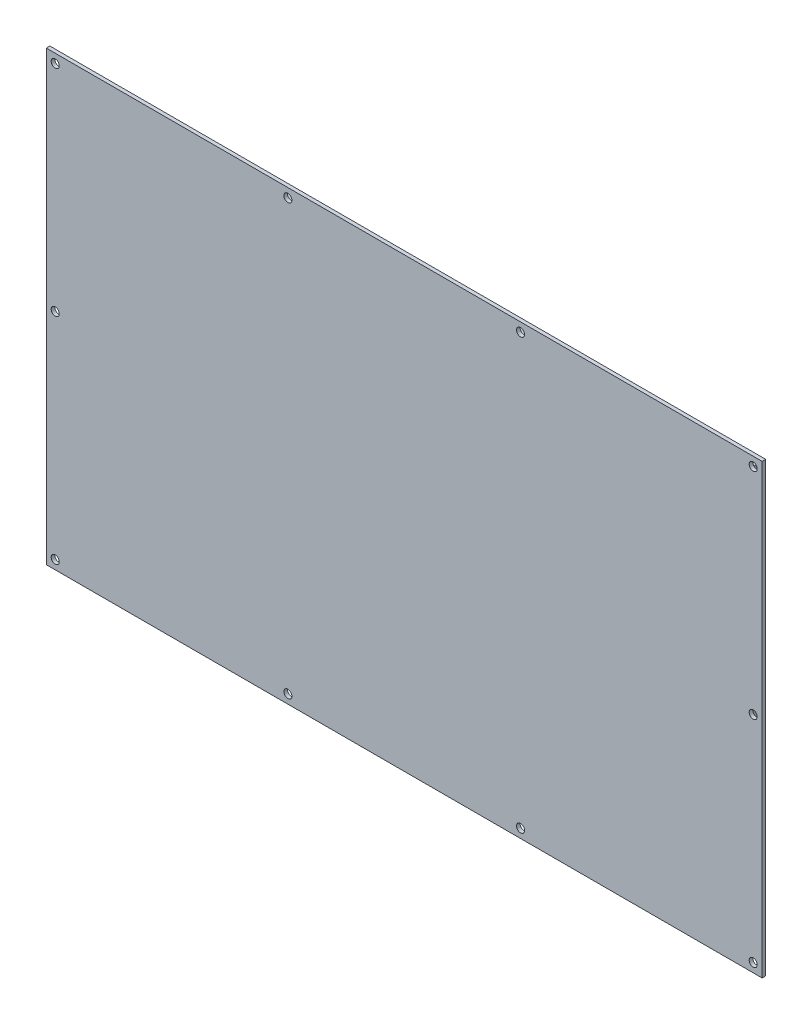
ISO-10303-21;
HEADER;
FILE_DESCRIPTION(('STEP AP214'),'2;1');
FILE_NAME('part.step','',(''),(''),'','','');
FILE_SCHEMA(('AUTOMOTIVE_DESIGN { 1 0 10303 214 1 1 1 1 }'));
ENDSEC;
DATA;
#1=APPLICATION_CONTEXT('core data for automotive mechanical design processes');
#2=APPLICATION_PROTOCOL_DEFINITION('international standard','automotive_design',2000,#1);
#3=PRODUCT_CONTEXT('',#1,'mechanical');
#4=PRODUCT('Part','Part','',(#3));
#5=PRODUCT_RELATED_PRODUCT_CATEGORY('part','',(#4));
#6=PRODUCT_DEFINITION_FORMATION('','',#4);
#7=PRODUCT_DEFINITION_CONTEXT('part definition',#1,'design');
#8=PRODUCT_DEFINITION('design','',#6,#7);
#9=PRODUCT_DEFINITION_SHAPE('','',#8);
#10=(LENGTH_UNIT() NAMED_UNIT(*) SI_UNIT(.MILLI.,.METRE.));
#11=(NAMED_UNIT(*) PLANE_ANGLE_UNIT() SI_UNIT($,.RADIAN.));
#12=(NAMED_UNIT(*) SI_UNIT($,.STERADIAN.) SOLID_ANGLE_UNIT());
#13=UNCERTAINTY_MEASURE_WITH_UNIT(LENGTH_MEASURE(1.E-05),#10,'distance_accuracy_value','');
#14=(GEOMETRIC_REPRESENTATION_CONTEXT(3) GLOBAL_UNCERTAINTY_ASSIGNED_CONTEXT((#13)) GLOBAL_UNIT_ASSIGNED_CONTEXT((#10,
#11,#12)) REPRESENTATION_CONTEXT('',''));
#15=CARTESIAN_POINT('',(0.,0.,0.));
#16=DIRECTION('',(0.,0.,1.));
#17=DIRECTION('',(1.,0.,0.));
#18=AXIS2_PLACEMENT_3D('',#15,#16,#17);
#19=CARTESIAN_POINT('',(200.,-125.,2.));
#20=DIRECTION('',(-1.,0.,0.));
#21=DIRECTION('',(0.,0.,1.));
#22=AXIS2_PLACEMENT_3D('',#19,#20,#21);
#23=PLANE('',#22);
#24=DIRECTION('',(0.,1.,0.));
#25=VECTOR('',#24,1.);
#26=CARTESIAN_POINT('',(200.,-125.,0.));
#27=LINE('',#26,#25);
#28=CARTESIAN_POINT('',(200.,-125.,0.));
#29=VERTEX_POINT('',#28);
#30=CARTESIAN_POINT('',(200.,125.,0.));
#31=VERTEX_POINT('',#30);
#32=EDGE_CURVE('E182',#29,#31,#27,.T.);
#33=ORIENTED_EDGE('',*,*,#32,.T.);
#34=DIRECTION('',(0.,0.,-1.));
#35=VECTOR('',#34,1.);
#36=CARTESIAN_POINT('',(200.,125.,2.));
#37=LINE('',#36,#35);
#38=CARTESIAN_POINT('',(200.,125.,2.));
#39=VERTEX_POINT('',#38);
#40=EDGE_CURVE('E11',#39,#31,#37,.T.);
#41=ORIENTED_EDGE('',*,*,#40,.F.);
#42=DIRECTION('',(0.,1.,0.));
#43=VECTOR('',#42,1.);
#44=CARTESIAN_POINT('',(200.,-125.,2.));
#45=LINE('',#44,#43);
#46=CARTESIAN_POINT('',(200.,-125.,2.));
#47=VERTEX_POINT('',#46);
#48=EDGE_CURVE('E185',#47,#39,#45,.T.);
#49=ORIENTED_EDGE('',*,*,#48,.F.);
#50=DIRECTION('',(0.,0.,-1.));
#51=VECTOR('',#50,1.);
#52=CARTESIAN_POINT('',(200.,-125.,2.));
#53=LINE('',#52,#51);
#54=EDGE_CURVE('E195',#47,#29,#53,.T.);
#55=ORIENTED_EDGE('',*,*,#54,.T.);
#56=EDGE_LOOP('',(#33,#41,#49,#55));
#57=FACE_BOUND('',#56,.T.);
#58=ADVANCED_FACE('F35',(#57),#23,.F.);
#59=CARTESIAN_POINT('',(-200.,125.,2.));
#60=DIRECTION('',(0.,-1.,0.));
#61=DIRECTION('',(0.,0.,-1.));
#62=AXIS2_PLACEMENT_3D('',#59,#60,#61);
#63=PLANE('',#62);
#64=DIRECTION('',(-1.,0.,0.));
#65=VECTOR('',#64,1.);
#66=CARTESIAN_POINT('',(-200.,125.,0.));
#67=LINE('',#66,#65);
#68=CARTESIAN_POINT('',(-200.,125.,0.));
#69=VERTEX_POINT('',#68);
#70=EDGE_CURVE('E198',#31,#69,#67,.T.);
#71=ORIENTED_EDGE('',*,*,#70,.T.);
#72=DIRECTION('',(0.,0.,-1.));
#73=VECTOR('',#72,1.);
#74=CARTESIAN_POINT('',(-200.,125.,2.));
#75=LINE('',#74,#73);
#76=CARTESIAN_POINT('',(-200.,125.,2.));
#77=VERTEX_POINT('',#76);
#78=EDGE_CURVE('E42',#77,#69,#75,.T.);
#79=ORIENTED_EDGE('',*,*,#78,.F.);
#80=DIRECTION('',(-1.,0.,0.));
#81=VECTOR('',#80,1.);
#82=CARTESIAN_POINT('',(-200.,125.,2.));
#83=LINE('',#82,#81);
#84=EDGE_CURVE('E188',#39,#77,#83,.T.);
#85=ORIENTED_EDGE('',*,*,#84,.F.);
#86=ORIENTED_EDGE('',*,*,#40,.T.);
#87=EDGE_LOOP('',(#71,#79,#85,#86));
#88=FACE_BOUND('',#87,.T.);
#89=ADVANCED_FACE('F228',(#88),#63,.F.);
#90=CARTESIAN_POINT('',(-200.,-125.,2.));
#91=DIRECTION('',(1.,0.,0.));
#92=DIRECTION('',(0.,0.,-1.));
#93=AXIS2_PLACEMENT_3D('',#90,#91,#92);
#94=PLANE('',#93);
#95=DIRECTION('',(0.,-1.,0.));
#96=VECTOR('',#95,1.);
#97=CARTESIAN_POINT('',(-200.,-125.,0.));
#98=LINE('',#97,#96);
#99=CARTESIAN_POINT('',(-200.,-125.,0.));
#100=VERTEX_POINT('',#99);
#101=EDGE_CURVE('E200',#69,#100,#98,.T.);
#102=ORIENTED_EDGE('',*,*,#101,.T.);
#103=DIRECTION('',(0.,0.,-1.));
#104=VECTOR('',#103,1.);
#105=CARTESIAN_POINT('',(-200.,-125.,2.));
#106=LINE('',#105,#104);
#107=CARTESIAN_POINT('',(-200.,-125.,2.));
#108=VERTEX_POINT('',#107);
#109=EDGE_CURVE('E205',#108,#100,#106,.T.);
#110=ORIENTED_EDGE('',*,*,#109,.F.);
#111=DIRECTION('',(0.,-1.,0.));
#112=VECTOR('',#111,1.);
#113=CARTESIAN_POINT('',(-200.,-125.,2.));
#114=LINE('',#113,#112);
#115=EDGE_CURVE('E191',#77,#108,#114,.T.);
#116=ORIENTED_EDGE('',*,*,#115,.F.);
#117=ORIENTED_EDGE('',*,*,#78,.T.);
#118=EDGE_LOOP('',(#102,#110,#116,#117));
#119=FACE_BOUND('',#118,.T.);
#120=ADVANCED_FACE('F212',(#119),#94,.F.);
#121=CARTESIAN_POINT('',(-200.,-125.,2.));
#122=DIRECTION('',(0.,1.,0.));
#123=DIRECTION('',(0.,0.,1.));
#124=AXIS2_PLACEMENT_3D('',#121,#122,#123);
#125=PLANE('',#124);
#126=DIRECTION('',(1.,0.,0.));
#127=VECTOR('',#126,1.);
#128=CARTESIAN_POINT('',(-200.,-125.,0.));
#129=LINE('',#128,#127);
#130=EDGE_CURVE('E189',#100,#29,#129,.T.);
#131=ORIENTED_EDGE('',*,*,#130,.T.);
#132=ORIENTED_EDGE('',*,*,#54,.F.);
#133=DIRECTION('',(1.,0.,0.));
#134=VECTOR('',#133,1.);
#135=CARTESIAN_POINT('',(-200.,-125.,2.));
#136=LINE('',#135,#134);
#137=EDGE_CURVE('E193',#108,#47,#136,.T.);
#138=ORIENTED_EDGE('',*,*,#137,.F.);
#139=ORIENTED_EDGE('',*,*,#109,.T.);
#140=EDGE_LOOP('',(#131,#132,#138,#139));
#141=FACE_BOUND('',#140,.T.);
#142=ADVANCED_FACE('F221',(#141),#125,.F.);
#143=CARTESIAN_POINT('',(0.,0.,2.));
#144=DIRECTION('',(0.,0.,-1.));
#145=DIRECTION('',(-1.,0.,0.));
#146=AXIS2_PLACEMENT_3D('',#143,#144,#145);
#147=PLANE('',#146);
#148=CARTESIAN_POINT('',(-195.,0.,2.));
#149=DIRECTION('',(0.,0.,1.));
#150=DIRECTION('',(-1.,0.,0.));
#151=AXIS2_PLACEMENT_3D('',#148,#149,#150);
#152=CIRCLE('',#151,2.25000000000001);
#153=CARTESIAN_POINT('',(-197.25,0.,2.));
#154=VERTEX_POINT('',#153);
#155=EDGE_CURVE('E150',#154,#154,#152,.T.);
#156=ORIENTED_EDGE('',*,*,#155,.F.);
#157=EDGE_LOOP('',(#156));
#158=FACE_BOUND('',#157,.T.);
#159=CARTESIAN_POINT('',(-195.,-120.,2.));
#160=DIRECTION('',(0.,0.,1.));
#161=DIRECTION('',(-1.,0.,0.));
#162=AXIS2_PLACEMENT_3D('',#159,#160,#161);
#163=CIRCLE('',#162,2.25000000000001);
#164=CARTESIAN_POINT('',(-197.25,-120.,2.));
#165=VERTEX_POINT('',#164);
#166=EDGE_CURVE('E144',#165,#165,#163,.T.);
#167=ORIENTED_EDGE('',*,*,#166,.F.);
#168=EDGE_LOOP('',(#167));
#169=FACE_BOUND('',#168,.T.);
#170=CARTESIAN_POINT('',(195.,-120.,2.));
#171=DIRECTION('',(0.,0.,1.));
#172=DIRECTION('',(-1.,0.,0.));
#173=AXIS2_PLACEMENT_3D('',#170,#171,#172);
#174=CIRCLE('',#173,2.25000000000001);
#175=CARTESIAN_POINT('',(192.75,-120.,2.));
#176=VERTEX_POINT('',#175);
#177=EDGE_CURVE('E138',#176,#176,#174,.T.);
#178=ORIENTED_EDGE('',*,*,#177,.F.);
#179=EDGE_LOOP('',(#178));
#180=FACE_BOUND('',#179,.T.);
#181=CARTESIAN_POINT('',(195.,120.,2.));
#182=DIRECTION('',(0.,0.,1.));
#183=DIRECTION('',(1.,0.,0.));
#184=AXIS2_PLACEMENT_3D('',#181,#182,#183);
#185=CIRCLE('',#184,2.25000000000001);
#186=CARTESIAN_POINT('',(197.25,120.,2.));
#187=VERTEX_POINT('',#186);
#188=EDGE_CURVE('E131',#187,#187,#185,.T.);
#189=ORIENTED_EDGE('',*,*,#188,.F.);
#190=EDGE_LOOP('',(#189));
#191=FACE_BOUND('',#190,.T.);
#192=CARTESIAN_POINT('',(64.9999999999999,120.,2.));
#193=DIRECTION('',(0.,0.,1.));
#194=DIRECTION('',(1.,0.,0.));
#195=AXIS2_PLACEMENT_3D('',#192,#193,#194);
#196=CIRCLE('',#195,2.25000000000001);
#197=CARTESIAN_POINT('',(67.25,120.,2.));
#198=VERTEX_POINT('',#197);
#199=EDGE_CURVE('E174',#198,#198,#196,.T.);
#200=ORIENTED_EDGE('',*,*,#199,.F.);
#201=EDGE_LOOP('',(#200));
#202=FACE_BOUND('',#201,.T.);
#203=CARTESIAN_POINT('',(-65.0000000000001,120.,2.));
#204=DIRECTION('',(0.,0.,1.));
#205=DIRECTION('',(1.,0.,0.));
#206=AXIS2_PLACEMENT_3D('',#203,#204,#205);
#207=CIRCLE('',#206,2.25000000000001);
#208=CARTESIAN_POINT('',(-62.75,120.,2.));
#209=VERTEX_POINT('',#208);
#210=EDGE_CURVE('E168',#209,#209,#207,.T.);
#211=ORIENTED_EDGE('',*,*,#210,.F.);
#212=EDGE_LOOP('',(#211));
#213=FACE_BOUND('',#212,.T.);
#214=CARTESIAN_POINT('',(64.9999999999999,-120.,2.));
#215=DIRECTION('',(0.,0.,1.));
#216=DIRECTION('',(-1.,0.,0.));
#217=AXIS2_PLACEMENT_3D('',#214,#215,#216);
#218=CIRCLE('',#217,2.25000000000001);
#219=CARTESIAN_POINT('',(62.7499999999999,-120.,2.));
#220=VERTEX_POINT('',#219);
#221=EDGE_CURVE('E162',#220,#220,#218,.T.);
#222=ORIENTED_EDGE('',*,*,#221,.F.);
#223=EDGE_LOOP('',(#222));
#224=FACE_BOUND('',#223,.T.);
#225=CARTESIAN_POINT('',(-65.,-120.,2.));
#226=DIRECTION('',(0.,0.,1.));
#227=DIRECTION('',(-1.,0.,0.));
#228=AXIS2_PLACEMENT_3D('',#225,#226,#227);
#229=CIRCLE('',#228,2.25000000000001);
#230=CARTESIAN_POINT('',(-67.25,-120.,2.));
#231=VERTEX_POINT('',#230);
#232=EDGE_CURVE('E155',#231,#231,#229,.T.);
#233=ORIENTED_EDGE('',*,*,#232,.F.);
#234=EDGE_LOOP('',(#233));
#235=FACE_BOUND('',#234,.T.);
#236=CARTESIAN_POINT('',(194.999999999999,0.,2.));
#237=DIRECTION('',(0.,0.,1.));
#238=DIRECTION('',(-1.,0.,0.));
#239=AXIS2_PLACEMENT_3D('',#236,#237,#238);
#240=CIRCLE('',#239,2.25000000000001);
#241=CARTESIAN_POINT('',(192.749999999999,0.,2.));
#242=VERTEX_POINT('',#241);
#243=EDGE_CURVE('E122',#242,#242,#240,.T.);
#244=ORIENTED_EDGE('',*,*,#243,.F.);
#245=EDGE_LOOP('',(#244));
#246=FACE_BOUND('',#245,.T.);
#247=CARTESIAN_POINT('',(-195.,120.,2.));
#248=DIRECTION('',(0.,0.,1.));
#249=DIRECTION('',(1.,0.,0.));
#250=AXIS2_PLACEMENT_3D('',#247,#248,#249);
#251=CIRCLE('',#250,2.25000000000001);
#252=CARTESIAN_POINT('',(-192.75,120.,2.));
#253=VERTEX_POINT('',#252);
#254=EDGE_CURVE('E179',#253,#253,#251,.T.);
#255=ORIENTED_EDGE('',*,*,#254,.F.);
#256=EDGE_LOOP('',(#255));
#257=FACE_BOUND('',#256,.T.);
#258=ORIENTED_EDGE('',*,*,#48,.T.);
#259=ORIENTED_EDGE('',*,*,#84,.T.);
#260=ORIENTED_EDGE('',*,*,#115,.T.);
#261=ORIENTED_EDGE('',*,*,#137,.T.);
#262=EDGE_LOOP('',(#258,#259,#260,#261));
#263=FACE_BOUND('',#262,.T.);
#264=ADVANCED_FACE('F227',(#158,#169,#180,#191,#202,#213,#224,#235,#246,#257,#263),#147,.F.);
#265=CARTESIAN_POINT('',(0.,0.,0.));
#266=DIRECTION('',(0.,0.,-1.));
#267=DIRECTION('',(-1.,0.,0.));
#268=AXIS2_PLACEMENT_3D('',#265,#266,#267);
#269=PLANE('',#268);
#270=DIRECTION('',(0.,1.,0.));
#271=VECTOR('',#270,1.);
#272=CARTESIAN_POINT('',(-190.,-115.,0.));
#273=LINE('',#272,#271);
#274=CARTESIAN_POINT('',(-190.,-115.,0.));
#275=VERTEX_POINT('',#274);
#276=CARTESIAN_POINT('',(-190.,115.,0.));
#277=VERTEX_POINT('',#276);
#278=EDGE_CURVE('E49',#275,#277,#273,.T.);
#279=ORIENTED_EDGE('',*,*,#278,.F.);
#280=DIRECTION('',(-1.,0.,0.));
#281=VECTOR('',#280,1.);
#282=CARTESIAN_POINT('',(190.,-115.,0.));
#283=LINE('',#282,#281);
#284=CARTESIAN_POINT('',(190.,-115.,0.));
#285=VERTEX_POINT('',#284);
#286=EDGE_CURVE('E53',#285,#275,#283,.T.);
#287=ORIENTED_EDGE('',*,*,#286,.F.);
#288=DIRECTION('',(0.,-1.,0.));
#289=VECTOR('',#288,1.);
#290=CARTESIAN_POINT('',(190.,-115.,0.));
#291=LINE('',#290,#289);
#292=CARTESIAN_POINT('',(190.,115.,0.));
#293=VERTEX_POINT('',#292);
#294=EDGE_CURVE('E423',#293,#285,#291,.T.);
#295=ORIENTED_EDGE('',*,*,#294,.F.);
#296=DIRECTION('',(1.,0.,0.));
#297=VECTOR('',#296,1.);
#298=CARTESIAN_POINT('',(190.,115.,0.));
#299=LINE('',#298,#297);
#300=EDGE_CURVE('E429',#277,#293,#299,.T.);
#301=ORIENTED_EDGE('',*,*,#300,.F.);
#302=EDGE_LOOP('',(#279,#287,#295,#301));
#303=FACE_BOUND('',#302,.T.);
#304=CARTESIAN_POINT('',(-195.,0.,0.));
#305=DIRECTION('',(0.,0.,-1.));
#306=DIRECTION('',(-1.,0.,0.));
#307=AXIS2_PLACEMENT_3D('',#304,#305,#306);
#308=CIRCLE('',#307,2.25000000000001);
#309=CARTESIAN_POINT('',(-197.25,0.,0.));
#310=VERTEX_POINT('',#309);
#311=EDGE_CURVE('E129',#310,#310,#308,.F.);
#312=ORIENTED_EDGE('',*,*,#311,.T.);
#313=EDGE_LOOP('',(#312));
#314=FACE_BOUND('',#313,.T.);
#315=CARTESIAN_POINT('',(-195.,-120.,0.));
#316=DIRECTION('',(0.,0.,-1.));
#317=DIRECTION('',(-1.,0.,0.));
#318=AXIS2_PLACEMENT_3D('',#315,#316,#317);
#319=CIRCLE('',#318,2.25000000000001);
#320=CARTESIAN_POINT('',(-197.25,-120.,0.));
#321=VERTEX_POINT('',#320);
#322=EDGE_CURVE('E147',#321,#321,#319,.F.);
#323=ORIENTED_EDGE('',*,*,#322,.T.);
#324=EDGE_LOOP('',(#323));
#325=FACE_BOUND('',#324,.T.);
#326=CARTESIAN_POINT('',(195.,-120.,0.));
#327=DIRECTION('',(0.,0.,-1.));
#328=DIRECTION('',(-1.,0.,0.));
#329=AXIS2_PLACEMENT_3D('',#326,#327,#328);
#330=CIRCLE('',#329,2.25000000000001);
#331=CARTESIAN_POINT('',(192.75,-120.,0.));
#332=VERTEX_POINT('',#331);
#333=EDGE_CURVE('E141',#332,#332,#330,.F.);
#334=ORIENTED_EDGE('',*,*,#333,.T.);
#335=EDGE_LOOP('',(#334));
#336=FACE_BOUND('',#335,.T.);
#337=CARTESIAN_POINT('',(195.,120.,0.));
#338=DIRECTION('',(0.,0.,-1.));
#339=DIRECTION('',(-1.,0.,0.));
#340=AXIS2_PLACEMENT_3D('',#337,#338,#339);
#341=CIRCLE('',#340,2.25000000000001);
#342=CARTESIAN_POINT('',(192.75,120.,0.));
#343=VERTEX_POINT('',#342);
#344=EDGE_CURVE('E135',#343,#343,#341,.F.);
#345=ORIENTED_EDGE('',*,*,#344,.T.);
#346=EDGE_LOOP('',(#345));
#347=FACE_BOUND('',#346,.T.);
#348=CARTESIAN_POINT('',(64.9999999999999,120.,0.));
#349=DIRECTION('',(0.,0.,-1.));
#350=DIRECTION('',(-1.,0.,0.));
#351=AXIS2_PLACEMENT_3D('',#348,#349,#350);
#352=CIRCLE('',#351,2.25000000000001);
#353=CARTESIAN_POINT('',(62.7499999999999,120.,0.));
#354=VERTEX_POINT('',#353);
#355=EDGE_CURVE('E134',#354,#354,#352,.F.);
#356=ORIENTED_EDGE('',*,*,#355,.T.);
#357=EDGE_LOOP('',(#356));
#358=FACE_BOUND('',#357,.T.);
#359=CARTESIAN_POINT('',(-65.0000000000001,120.,0.));
#360=DIRECTION('',(0.,0.,-1.));
#361=DIRECTION('',(-1.,0.,0.));
#362=AXIS2_PLACEMENT_3D('',#359,#360,#361);
#363=CIRCLE('',#362,2.25000000000001);
#364=CARTESIAN_POINT('',(-67.2500000000001,120.,0.));
#365=VERTEX_POINT('',#364);
#366=EDGE_CURVE('E171',#365,#365,#363,.F.);
#367=ORIENTED_EDGE('',*,*,#366,.T.);
#368=EDGE_LOOP('',(#367));
#369=FACE_BOUND('',#368,.T.);
#370=CARTESIAN_POINT('',(64.9999999999999,-120.,0.));
#371=DIRECTION('',(0.,0.,-1.));
#372=DIRECTION('',(-1.,0.,0.));
#373=AXIS2_PLACEMENT_3D('',#370,#371,#372);
#374=CIRCLE('',#373,2.25000000000001);
#375=CARTESIAN_POINT('',(62.7499999999999,-120.,0.));
#376=VERTEX_POINT('',#375);
#377=EDGE_CURVE('E165',#376,#376,#374,.F.);
#378=ORIENTED_EDGE('',*,*,#377,.T.);
#379=EDGE_LOOP('',(#378));
#380=FACE_BOUND('',#379,.T.);
#381=CARTESIAN_POINT('',(-65.,-120.,0.));
#382=DIRECTION('',(0.,0.,-1.));
#383=DIRECTION('',(-1.,0.,0.));
#384=AXIS2_PLACEMENT_3D('',#381,#382,#383);
#385=CIRCLE('',#384,2.25000000000001);
#386=CARTESIAN_POINT('',(-67.25,-120.,0.));
#387=VERTEX_POINT('',#386);
#388=EDGE_CURVE('E159',#387,#387,#385,.F.);
#389=ORIENTED_EDGE('',*,*,#388,.T.);
#390=EDGE_LOOP('',(#389));
#391=FACE_BOUND('',#390,.T.);
#392=CARTESIAN_POINT('',(194.999999999999,0.,0.));
#393=DIRECTION('',(0.,0.,-1.));
#394=DIRECTION('',(-1.,0.,0.));
#395=AXIS2_PLACEMENT_3D('',#392,#393,#394);
#396=CIRCLE('',#395,2.25000000000001);
#397=CARTESIAN_POINT('',(192.749999999999,0.,0.));
#398=VERTEX_POINT('',#397);
#399=EDGE_CURVE('E119',#398,#398,#396,.F.);
#400=ORIENTED_EDGE('',*,*,#399,.T.);
#401=EDGE_LOOP('',(#400));
#402=FACE_BOUND('',#401,.T.);
#403=CARTESIAN_POINT('',(-195.,120.,0.));
#404=DIRECTION('',(0.,0.,-1.));
#405=DIRECTION('',(-1.,0.,0.));
#406=AXIS2_PLACEMENT_3D('',#403,#404,#405);
#407=CIRCLE('',#406,2.25000000000001);
#408=CARTESIAN_POINT('',(-197.25,120.,0.));
#409=VERTEX_POINT('',#408);
#410=EDGE_CURVE('E158',#409,#409,#407,.F.);
#411=ORIENTED_EDGE('',*,*,#410,.T.);
#412=EDGE_LOOP('',(#411));
#413=FACE_BOUND('',#412,.T.);
#414=ORIENTED_EDGE('',*,*,#32,.F.);
#415=ORIENTED_EDGE('',*,*,#130,.F.);
#416=ORIENTED_EDGE('',*,*,#101,.F.);
#417=ORIENTED_EDGE('',*,*,#70,.F.);
#418=EDGE_LOOP('',(#414,#415,#416,#417));
#419=FACE_BOUND('',#418,.T.);
#420=ADVANCED_FACE('F218',(#303,#314,#325,#336,#347,#358,#369,#380,#391,#402,#413,#419),#269,.T.);
#421=CARTESIAN_POINT('',(-195.,120.,-0.00100000000000013));
#422=DIRECTION('',(0.,0.,1.));
#423=DIRECTION('',(1.,0.,0.));
#424=AXIS2_PLACEMENT_3D('',#421,#422,#423);
#425=CYLINDRICAL_SURFACE('',#424,2.25000000000001);
#426=ORIENTED_EDGE('',*,*,#410,.F.);
#427=EDGE_LOOP('',(#426));
#428=FACE_BOUND('',#427,.T.);
#429=ORIENTED_EDGE('',*,*,#254,.T.);
#430=EDGE_LOOP('',(#429));
#431=FACE_BOUND('',#430,.T.);
#432=ADVANCED_FACE('F240',(#428,#431),#425,.F.);
#433=CARTESIAN_POINT('',(194.999999999999,0.,-0.00100000000000013));
#434=DIRECTION('',(0.,0.,1.));
#435=DIRECTION('',(1.,0.,0.));
#436=AXIS2_PLACEMENT_3D('',#433,#434,#435);
#437=CYLINDRICAL_SURFACE('',#436,2.25000000000001);
#438=ORIENTED_EDGE('',*,*,#399,.F.);
#439=EDGE_LOOP('',(#438));
#440=FACE_BOUND('',#439,.T.);
#441=ORIENTED_EDGE('',*,*,#243,.T.);
#442=EDGE_LOOP('',(#441));
#443=FACE_BOUND('',#442,.T.);
#444=ADVANCED_FACE('F246',(#440,#443),#437,.F.);
#445=CARTESIAN_POINT('',(-65.,-120.,-0.00100000000000013));
#446=DIRECTION('',(0.,0.,1.));
#447=DIRECTION('',(1.,0.,0.));
#448=AXIS2_PLACEMENT_3D('',#445,#446,#447);
#449=CYLINDRICAL_SURFACE('',#448,2.25000000000001);
#450=ORIENTED_EDGE('',*,*,#388,.F.);
#451=EDGE_LOOP('',(#450));
#452=FACE_BOUND('',#451,.T.);
#453=ORIENTED_EDGE('',*,*,#232,.T.);
#454=EDGE_LOOP('',(#453));
#455=FACE_BOUND('',#454,.T.);
#456=ADVANCED_FACE('F260',(#452,#455),#449,.F.);
#457=CARTESIAN_POINT('',(64.9999999999999,-120.,-0.00100000000000013));
#458=DIRECTION('',(0.,0.,1.));
#459=DIRECTION('',(1.,0.,0.));
#460=AXIS2_PLACEMENT_3D('',#457,#458,#459);
#461=CYLINDRICAL_SURFACE('',#460,2.25000000000001);
#462=ORIENTED_EDGE('',*,*,#377,.F.);
#463=EDGE_LOOP('',(#462));
#464=FACE_BOUND('',#463,.T.);
#465=ORIENTED_EDGE('',*,*,#221,.T.);
#466=EDGE_LOOP('',(#465));
#467=FACE_BOUND('',#466,.T.);
#468=ADVANCED_FACE('F256',(#464,#467),#461,.F.);
#469=CARTESIAN_POINT('',(-65.0000000000001,120.,-0.00100000000000013));
#470=DIRECTION('',(0.,0.,1.));
#471=DIRECTION('',(1.,0.,0.));
#472=AXIS2_PLACEMENT_3D('',#469,#470,#471);
#473=CYLINDRICAL_SURFACE('',#472,2.25000000000001);
#474=ORIENTED_EDGE('',*,*,#366,.F.);
#475=EDGE_LOOP('',(#474));
#476=FACE_BOUND('',#475,.T.);
#477=ORIENTED_EDGE('',*,*,#210,.T.);
#478=EDGE_LOOP('',(#477));
#479=FACE_BOUND('',#478,.T.);
#480=ADVANCED_FACE('F252',(#476,#479),#473,.F.);
#481=CARTESIAN_POINT('',(64.9999999999999,120.,-0.00100000000000013));
#482=DIRECTION('',(0.,0.,1.));
#483=DIRECTION('',(1.,0.,0.));
#484=AXIS2_PLACEMENT_3D('',#481,#482,#483);
#485=CYLINDRICAL_SURFACE('',#484,2.25000000000001);
#486=ORIENTED_EDGE('',*,*,#355,.F.);
#487=EDGE_LOOP('',(#486));
#488=FACE_BOUND('',#487,.T.);
#489=ORIENTED_EDGE('',*,*,#199,.T.);
#490=EDGE_LOOP('',(#489));
#491=FACE_BOUND('',#490,.T.);
#492=ADVANCED_FACE('F248',(#488,#491),#485,.F.);
#493=CARTESIAN_POINT('',(195.,120.,-0.00100000000000013));
#494=DIRECTION('',(0.,0.,1.));
#495=DIRECTION('',(1.,0.,0.));
#496=AXIS2_PLACEMENT_3D('',#493,#494,#495);
#497=CYLINDRICAL_SURFACE('',#496,2.25000000000001);
#498=ORIENTED_EDGE('',*,*,#344,.F.);
#499=EDGE_LOOP('',(#498));
#500=FACE_BOUND('',#499,.T.);
#501=ORIENTED_EDGE('',*,*,#188,.T.);
#502=EDGE_LOOP('',(#501));
#503=FACE_BOUND('',#502,.T.);
#504=ADVANCED_FACE('F251',(#500,#503),#497,.F.);
#505=CARTESIAN_POINT('',(195.,-120.,-0.00100000000000013));
#506=DIRECTION('',(0.,0.,1.));
#507=DIRECTION('',(1.,0.,0.));
#508=AXIS2_PLACEMENT_3D('',#505,#506,#507);
#509=CYLINDRICAL_SURFACE('',#508,2.25000000000001);
#510=ORIENTED_EDGE('',*,*,#333,.F.);
#511=EDGE_LOOP('',(#510));
#512=FACE_BOUND('',#511,.T.);
#513=ORIENTED_EDGE('',*,*,#177,.T.);
#514=EDGE_LOOP('',(#513));
#515=FACE_BOUND('',#514,.T.);
#516=ADVANCED_FACE('F272',(#512,#515),#509,.F.);
#517=CARTESIAN_POINT('',(-195.,-120.,-0.00100000000000013));
#518=DIRECTION('',(0.,0.,1.));
#519=DIRECTION('',(1.,0.,0.));
#520=AXIS2_PLACEMENT_3D('',#517,#518,#519);
#521=CYLINDRICAL_SURFACE('',#520,2.25000000000001);
#522=ORIENTED_EDGE('',*,*,#322,.F.);
#523=EDGE_LOOP('',(#522));
#524=FACE_BOUND('',#523,.T.);
#525=ORIENTED_EDGE('',*,*,#166,.T.);
#526=EDGE_LOOP('',(#525));
#527=FACE_BOUND('',#526,.T.);
#528=ADVANCED_FACE('F268',(#524,#527),#521,.F.);
#529=CARTESIAN_POINT('',(-195.,0.,-0.00100000000000013));
#530=DIRECTION('',(0.,0.,1.));
#531=DIRECTION('',(1.,0.,0.));
#532=AXIS2_PLACEMENT_3D('',#529,#530,#531);
#533=CYLINDRICAL_SURFACE('',#532,2.25000000000001);
#534=ORIENTED_EDGE('',*,*,#311,.F.);
#535=EDGE_LOOP('',(#534));
#536=FACE_BOUND('',#535,.T.);
#537=ORIENTED_EDGE('',*,*,#155,.T.);
#538=EDGE_LOOP('',(#537));
#539=FACE_BOUND('',#538,.T.);
#540=ADVANCED_FACE('F265',(#536,#539),#533,.F.);
#541=CARTESIAN_POINT('',(-190.,-115.,-6.));
#542=DIRECTION('',(1.,0.,0.));
#543=DIRECTION('',(0.,0.,-1.));
#544=AXIS2_PLACEMENT_3D('',#541,#542,#543);
#545=PLANE('',#544);
#546=ORIENTED_EDGE('',*,*,#278,.T.);
#547=DIRECTION('',(0.,0.,1.));
#548=VECTOR('',#547,1.);
#549=CARTESIAN_POINT('',(-190.,115.,-6.));
#550=LINE('',#549,#548);
#551=CARTESIAN_POINT('',(-190.,115.,-6.));
#552=VERTEX_POINT('',#551);
#553=EDGE_CURVE('E102',#552,#277,#550,.T.);
#554=ORIENTED_EDGE('',*,*,#553,.F.);
#555=DIRECTION('',(0.,1.,0.));
#556=VECTOR('',#555,1.);
#557=CARTESIAN_POINT('',(-190.,-115.,-6.));
#558=LINE('',#557,#556);
#559=CARTESIAN_POINT('',(-190.,-115.,-6.));
#560=VERTEX_POINT('',#559);
#561=EDGE_CURVE('E108',#560,#552,#558,.T.);
#562=ORIENTED_EDGE('',*,*,#561,.F.);
#563=DIRECTION('',(0.,0.,1.));
#564=VECTOR('',#563,1.);
#565=CARTESIAN_POINT('',(-190.,-115.,-6.));
#566=LINE('',#565,#564);
#567=EDGE_CURVE('E421',#560,#275,#566,.T.);
#568=ORIENTED_EDGE('',*,*,#567,.T.);
#569=EDGE_LOOP('',(#546,#554,#562,#568));
#570=FACE_BOUND('',#569,.T.);
#571=ADVANCED_FACE('F118',(#570),#545,.F.);
#572=CARTESIAN_POINT('',(190.,115.,-6.));
#573=DIRECTION('',(0.,-1.,0.));
#574=DIRECTION('',(0.,0.,-1.));
#575=AXIS2_PLACEMENT_3D('',#572,#573,#574);
#576=PLANE('',#575);
#577=ORIENTED_EDGE('',*,*,#300,.T.);
#578=DIRECTION('',(0.,0.,1.));
#579=VECTOR('',#578,1.);
#580=CARTESIAN_POINT('',(190.,115.,-6.));
#581=LINE('',#580,#579);
#582=CARTESIAN_POINT('',(190.,115.,-6.));
#583=VERTEX_POINT('',#582);
#584=EDGE_CURVE('E104',#583,#293,#581,.T.);
#585=ORIENTED_EDGE('',*,*,#584,.F.);
#586=DIRECTION('',(1.,0.,0.));
#587=VECTOR('',#586,1.);
#588=CARTESIAN_POINT('',(190.,115.,-6.));
#589=LINE('',#588,#587);
#590=EDGE_CURVE('E97',#552,#583,#589,.T.);
#591=ORIENTED_EDGE('',*,*,#590,.F.);
#592=ORIENTED_EDGE('',*,*,#553,.T.);
#593=EDGE_LOOP('',(#577,#585,#591,#592));
#594=FACE_BOUND('',#593,.T.);
#595=ADVANCED_FACE('F100',(#594),#576,.F.);
#596=CARTESIAN_POINT('',(190.,-115.,-6.));
#597=DIRECTION('',(-1.,0.,0.));
#598=DIRECTION('',(0.,0.,1.));
#599=AXIS2_PLACEMENT_3D('',#596,#597,#598);
#600=PLANE('',#599);
#601=ORIENTED_EDGE('',*,*,#294,.T.);
#602=DIRECTION('',(0.,0.,1.));
#603=VECTOR('',#602,1.);
#604=CARTESIAN_POINT('',(190.,-115.,-6.));
#605=LINE('',#604,#603);
#606=CARTESIAN_POINT('',(190.,-115.,-6.));
#607=VERTEX_POINT('',#606);
#608=EDGE_CURVE('E124',#607,#285,#605,.T.);
#609=ORIENTED_EDGE('',*,*,#608,.F.);
#610=DIRECTION('',(0.,-1.,0.));
#611=VECTOR('',#610,1.);
#612=CARTESIAN_POINT('',(190.,-115.,-6.));
#613=LINE('',#612,#611);
#614=EDGE_CURVE('E107',#583,#607,#613,.T.);
#615=ORIENTED_EDGE('',*,*,#614,.F.);
#616=ORIENTED_EDGE('',*,*,#584,.T.);
#617=EDGE_LOOP('',(#601,#609,#615,#616));
#618=FACE_BOUND('',#617,.T.);
#619=ADVANCED_FACE('F287',(#618),#600,.F.);
#620=CARTESIAN_POINT('',(190.,-115.,-6.));
#621=DIRECTION('',(0.,1.,0.));
#622=DIRECTION('',(0.,0.,1.));
#623=AXIS2_PLACEMENT_3D('',#620,#621,#622);
#624=PLANE('',#623);
#625=ORIENTED_EDGE('',*,*,#286,.T.);
#626=ORIENTED_EDGE('',*,*,#567,.F.);
#627=DIRECTION('',(-1.,0.,0.));
#628=VECTOR('',#627,1.);
#629=CARTESIAN_POINT('',(190.,-115.,-6.));
#630=LINE('',#629,#628);
#631=EDGE_CURVE('E113',#607,#560,#630,.T.);
#632=ORIENTED_EDGE('',*,*,#631,.F.);
#633=ORIENTED_EDGE('',*,*,#608,.T.);
#634=EDGE_LOOP('',(#625,#626,#632,#633));
#635=FACE_BOUND('',#634,.T.);
#636=ADVANCED_FACE('F290',(#635),#624,.F.);
#637=CARTESIAN_POINT('',(0.,0.,-6.));
#638=DIRECTION('',(0.,0.,1.));
#639=DIRECTION('',(1.,0.,0.));
#640=AXIS2_PLACEMENT_3D('',#637,#638,#639);
#641=PLANE('',#640);
#642=ORIENTED_EDGE('',*,*,#561,.T.);
#643=ORIENTED_EDGE('',*,*,#590,.T.);
#644=ORIENTED_EDGE('',*,*,#614,.T.);
#645=ORIENTED_EDGE('',*,*,#631,.T.);
#646=EDGE_LOOP('',(#642,#643,#644,#645));
#647=FACE_BOUND('',#646,.T.);
#648=ADVANCED_FACE('F111',(#647),#641,.F.);
#649=CLOSED_SHELL('',(#58,#89,#120,#142,#264,#420,#432,#444,#456,#468,#480,#492,#504,#516,#528,
#540,#571,#595,#619,#636,#648));
#650=MANIFOLD_SOLID_BREP('B2',#649);
#651=ADVANCED_BREP_SHAPE_REPRESENTATION('',(#18,#650),#14);
#652=SHAPE_DEFINITION_REPRESENTATION(#9,#651);
ENDSEC;
END-ISO-10303-21;
